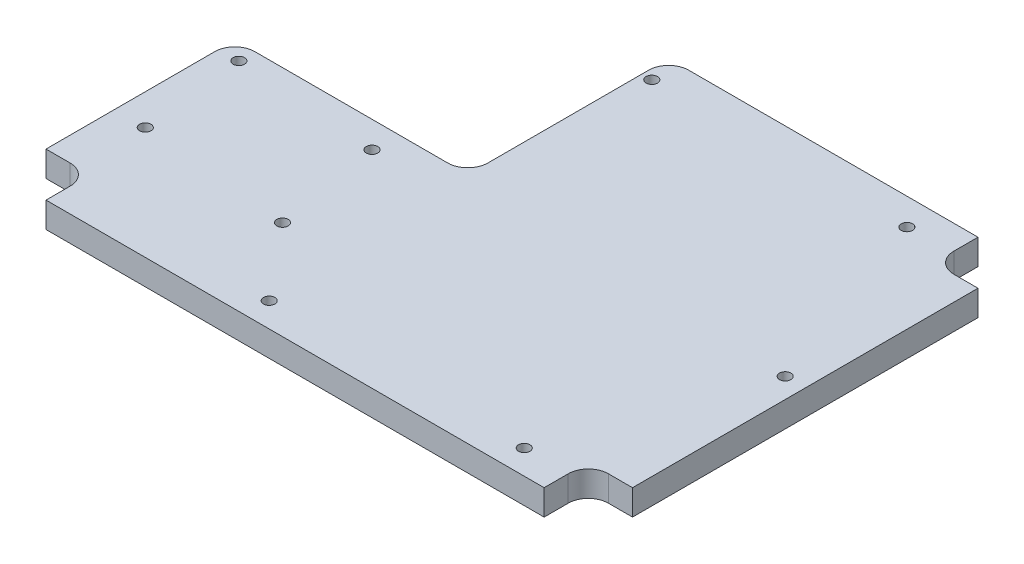
ISO-10303-21;
HEADER;
FILE_DESCRIPTION(('STEP AP214'),'2;1');
FILE_NAME('part.step','',(''),(''),'','','');
FILE_SCHEMA(('AUTOMOTIVE_DESIGN { 1 0 10303 214 1 1 1 1 }'));
ENDSEC;
DATA;
#1=APPLICATION_CONTEXT('core data for automotive mechanical design processes');
#2=APPLICATION_PROTOCOL_DEFINITION('international standard','automotive_design',2000,#1);
#3=PRODUCT_CONTEXT('',#1,'mechanical');
#4=PRODUCT('Part','Part','',(#3));
#5=PRODUCT_RELATED_PRODUCT_CATEGORY('part','',(#4));
#6=PRODUCT_DEFINITION_FORMATION('','',#4);
#7=PRODUCT_DEFINITION_CONTEXT('part definition',#1,'design');
#8=PRODUCT_DEFINITION('design','',#6,#7);
#9=PRODUCT_DEFINITION_SHAPE('','',#8);
#10=(LENGTH_UNIT() NAMED_UNIT(*) SI_UNIT(.MILLI.,.METRE.));
#11=(NAMED_UNIT(*) PLANE_ANGLE_UNIT() SI_UNIT($,.RADIAN.));
#12=(NAMED_UNIT(*) SI_UNIT($,.STERADIAN.) SOLID_ANGLE_UNIT());
#13=UNCERTAINTY_MEASURE_WITH_UNIT(LENGTH_MEASURE(1.E-05),#10,'distance_accuracy_value','');
#14=(GEOMETRIC_REPRESENTATION_CONTEXT(3) GLOBAL_UNCERTAINTY_ASSIGNED_CONTEXT((#13)) GLOBAL_UNIT_ASSIGNED_CONTEXT((#10,
#11,#12)) REPRESENTATION_CONTEXT('',''));
#15=CARTESIAN_POINT('',(0.,0.,0.));
#16=DIRECTION('',(0.,0.,1.));
#17=DIRECTION('',(1.,0.,0.));
#18=AXIS2_PLACEMENT_3D('',#15,#16,#17);
#19=CARTESIAN_POINT('',(-67.,6.35,48.0000000000003));
#20=DIRECTION('',(0.,1.,0.));
#21=DIRECTION('',(0.,0.,1.));
#22=AXIS2_PLACEMENT_3D('',#19,#20,#21);
#23=PLANE('',#22);
#24=CARTESIAN_POINT('',(-12.5264253099814,6.35,-47.3249999999997));
#25=DIRECTION('',(0.,1.,0.));
#26=DIRECTION('',(0.,0.,-1.));
#27=AXIS2_PLACEMENT_3D('',#24,#25,#26);
#28=CIRCLE('',#27,1.42240000000001);
#29=CARTESIAN_POINT('',(-12.5264253099814,6.35,-48.7473999999997));
#30=VERTEX_POINT('',#29);
#31=EDGE_CURVE('E388',#30,#30,#28,.T.);
#32=ORIENTED_EDGE('',*,*,#31,.F.);
#33=EDGE_LOOP('',(#32));
#34=FACE_BOUND('',#33,.T.);
#35=CARTESIAN_POINT('',(-12.5264253099814,6.35,47.9248996653101));
#36=DIRECTION('',(0.,1.,0.));
#37=DIRECTION('',(0.,0.,-1.));
#38=AXIS2_PLACEMENT_3D('',#35,#36,#37);
#39=CIRCLE('',#38,1.42240000000004);
#40=CARTESIAN_POINT('',(-12.5264253099814,6.35,46.5024996653101));
#41=VERTEX_POINT('',#40);
#42=EDGE_CURVE('E400',#41,#41,#39,.T.);
#43=ORIENTED_EDGE('',*,*,#42,.F.);
#44=EDGE_LOOP('',(#43));
#45=FACE_BOUND('',#44,.T.);
#46=CARTESIAN_POINT('',(-65.2864253099814,6.35,26.0000000000003));
#47=DIRECTION('',(0.,1.,0.));
#48=DIRECTION('',(0.,0.,1.));
#49=AXIS2_PLACEMENT_3D('',#46,#47,#48);
#50=CIRCLE('',#49,1.42240000000007);
#51=CARTESIAN_POINT('',(-65.2864253099814,6.35,27.4224000000004));
#52=VERTEX_POINT('',#51);
#53=EDGE_CURVE('E412',#52,#52,#50,.T.);
#54=ORIENTED_EDGE('',*,*,#53,.F.);
#55=EDGE_LOOP('',(#54));
#56=FACE_BOUND('',#55,.T.);
#57=CARTESIAN_POINT('',(-68.,6.35,0.));
#58=DIRECTION('',(0.,1.,0.));
#59=DIRECTION('',(0.,0.,1.));
#60=AXIS2_PLACEMENT_3D('',#57,#58,#59);
#61=CIRCLE('',#60,1.42240000000001);
#62=CARTESIAN_POINT('',(-68.,6.35,1.42240000000002));
#63=VERTEX_POINT('',#62);
#64=EDGE_CURVE('E424',#63,#63,#61,.T.);
#65=ORIENTED_EDGE('',*,*,#64,.F.);
#66=EDGE_LOOP('',(#65));
#67=FACE_BOUND('',#66,.T.);
#68=DIRECTION('',(1.,0.,0.));
#69=VECTOR('',#68,1.);
#70=CARTESIAN_POINT('',(-73.,6.35,43.0000000000003));
#71=LINE('',#70,#69);
#72=CARTESIAN_POINT('',(-73.,6.35,43.0000000000003));
#73=VERTEX_POINT('',#72);
#74=CARTESIAN_POINT('',(-67.,6.35,43.0000000000003));
#75=VERTEX_POINT('',#74);
#76=EDGE_CURVE('E223',#73,#75,#71,.T.);
#77=ORIENTED_EDGE('',*,*,#76,.T.);
#78=CARTESIAN_POINT('',(-67.,6.35,48.0000000000003));
#79=DIRECTION('',(0.,-1.,0.));
#80=DIRECTION('',(0.,0.,1.));
#81=AXIS2_PLACEMENT_3D('',#78,#79,#80);
#82=CIRCLE('',#81,5.);
#83=CARTESIAN_POINT('',(-62.,6.35,48.0000000000003));
#84=VERTEX_POINT('',#83);
#85=EDGE_CURVE('E121',#75,#84,#82,.T.);
#86=ORIENTED_EDGE('',*,*,#85,.T.);
#87=DIRECTION('',(0.,0.,1.));
#88=VECTOR('',#87,1.);
#89=CARTESIAN_POINT('',(-62.,6.35,48.0000000000003));
#90=LINE('',#89,#88);
#91=CARTESIAN_POINT('',(-62.,6.35,54.0000000000003));
#92=VERTEX_POINT('',#91);
#93=EDGE_CURVE('E268',#84,#92,#90,.T.);
#94=ORIENTED_EDGE('',*,*,#93,.T.);
#95=DIRECTION('',(1.,0.,0.));
#96=VECTOR('',#95,1.);
#97=CARTESIAN_POINT('',(-62.,6.35,54.0000000000003));
#98=LINE('',#97,#96);
#99=CARTESIAN_POINT('',(62.,6.35,54.0000000000003));
#100=VERTEX_POINT('',#99);
#101=EDGE_CURVE('E287',#92,#100,#98,.T.);
#102=ORIENTED_EDGE('',*,*,#101,.T.);
#103=DIRECTION('',(0.,0.,-1.));
#104=VECTOR('',#103,1.);
#105=CARTESIAN_POINT('',(62.,6.35,54.0000000000003));
#106=LINE('',#105,#104);
#107=CARTESIAN_POINT('',(61.9999999999997,6.35,48.0000000000003));
#108=VERTEX_POINT('',#107);
#109=EDGE_CURVE('E284',#100,#108,#106,.T.);
#110=ORIENTED_EDGE('',*,*,#109,.T.);
#111=CARTESIAN_POINT('',(67.,6.35,48.0000000000003));
#112=DIRECTION('',(0.,-1.,0.));
#113=DIRECTION('',(0.,0.,-1.));
#114=AXIS2_PLACEMENT_3D('',#111,#112,#113);
#115=CIRCLE('',#114,5.00000000000029);
#116=CARTESIAN_POINT('',(67.,6.35,42.9999999999997));
#117=VERTEX_POINT('',#116);
#118=EDGE_CURVE('E286',#108,#117,#115,.T.);
#119=ORIENTED_EDGE('',*,*,#118,.T.);
#120=DIRECTION('',(1.,0.,0.));
#121=VECTOR('',#120,1.);
#122=CARTESIAN_POINT('',(67.,6.35,42.9999999999997));
#123=LINE('',#122,#121);
#124=CARTESIAN_POINT('',(73.,6.35,42.9999999999997));
#125=VERTEX_POINT('',#124);
#126=EDGE_CURVE('E289',#117,#125,#123,.T.);
#127=ORIENTED_EDGE('',*,*,#126,.T.);
#128=DIRECTION('',(0.,0.,-1.));
#129=VECTOR('',#128,1.);
#130=CARTESIAN_POINT('',(73.,6.35,42.9999999999997));
#131=LINE('',#130,#129);
#132=CARTESIAN_POINT('',(73.,6.35,-42.9999999999997));
#133=VERTEX_POINT('',#132);
#134=EDGE_CURVE('E295',#125,#133,#131,.T.);
#135=ORIENTED_EDGE('',*,*,#134,.T.);
#136=DIRECTION('',(-1.,0.,0.));
#137=VECTOR('',#136,1.);
#138=CARTESIAN_POINT('',(73.,6.35,-42.9999999999997));
#139=LINE('',#138,#137);
#140=CARTESIAN_POINT('',(67.,6.35,-42.9999999999997));
#141=VERTEX_POINT('',#140);
#142=EDGE_CURVE('E297',#133,#141,#139,.T.);
#143=ORIENTED_EDGE('',*,*,#142,.T.);
#144=CARTESIAN_POINT('',(67.,6.35,-47.9999999999997));
#145=DIRECTION('',(0.,-1.,0.));
#146=DIRECTION('',(0.,0.,1.));
#147=AXIS2_PLACEMENT_3D('',#144,#145,#146);
#148=CIRCLE('',#147,5.00000000000001);
#149=CARTESIAN_POINT('',(62.,6.35,-47.9999999999997));
#150=VERTEX_POINT('',#149);
#151=EDGE_CURVE('E299',#141,#150,#148,.T.);
#152=ORIENTED_EDGE('',*,*,#151,.T.);
#153=DIRECTION('',(0.,0.,-1.));
#154=VECTOR('',#153,1.);
#155=CARTESIAN_POINT('',(62.,6.35,-47.9999999999997));
#156=LINE('',#155,#154);
#157=CARTESIAN_POINT('',(62.,6.35,-53.9999999999997));
#158=VERTEX_POINT('',#157);
#159=EDGE_CURVE('E301',#150,#158,#156,.T.);
#160=ORIENTED_EDGE('',*,*,#159,.T.);
#161=DIRECTION('',(-1.,0.,0.));
#162=VECTOR('',#161,1.);
#163=CARTESIAN_POINT('',(62.,6.35,-53.9999999999997));
#164=LINE('',#163,#162);
#165=CARTESIAN_POINT('',(-10.,6.35,-53.9999999999997));
#166=VERTEX_POINT('',#165);
#167=EDGE_CURVE('E303',#158,#166,#164,.T.);
#168=ORIENTED_EDGE('',*,*,#167,.T.);
#169=CARTESIAN_POINT('',(-10.,6.35,-48.9999999999997));
#170=DIRECTION('',(0.,1.,0.));
#171=DIRECTION('',(0.,0.,-1.));
#172=AXIS2_PLACEMENT_3D('',#169,#170,#171);
#173=CIRCLE('',#172,5.);
#174=CARTESIAN_POINT('',(-15.,6.35,-48.9999999999997));
#175=VERTEX_POINT('',#174);
#176=EDGE_CURVE('E305',#166,#175,#173,.T.);
#177=ORIENTED_EDGE('',*,*,#176,.T.);
#178=DIRECTION('',(0.,0.,1.));
#179=VECTOR('',#178,1.);
#180=CARTESIAN_POINT('',(-15.,6.35,-48.9999999999997));
#181=LINE('',#180,#179);
#182=CARTESIAN_POINT('',(-15.,6.35,-8.99999999999971));
#183=VERTEX_POINT('',#182);
#184=EDGE_CURVE('E307',#175,#183,#181,.T.);
#185=ORIENTED_EDGE('',*,*,#184,.T.);
#186=CARTESIAN_POINT('',(-20.,6.35,-8.99999999999971));
#187=DIRECTION('',(0.,-1.,0.));
#188=DIRECTION('',(0.,0.,1.));
#189=AXIS2_PLACEMENT_3D('',#186,#187,#188);
#190=CIRCLE('',#189,5.);
#191=CARTESIAN_POINT('',(-20.,6.35,-3.99999999999971));
#192=VERTEX_POINT('',#191);
#193=EDGE_CURVE('E170',#183,#192,#190,.T.);
#194=ORIENTED_EDGE('',*,*,#193,.T.);
#195=DIRECTION('',(-1.,0.,0.));
#196=VECTOR('',#195,1.);
#197=CARTESIAN_POINT('',(-20.,6.35,-3.99999999999971));
#198=LINE('',#197,#196);
#199=CARTESIAN_POINT('',(-68.,6.35,-3.99999999999969));
#200=VERTEX_POINT('',#199);
#201=EDGE_CURVE('E164',#192,#200,#198,.T.);
#202=ORIENTED_EDGE('',*,*,#201,.T.);
#203=CARTESIAN_POINT('',(-68.,6.35,1.00000000000031));
#204=DIRECTION('',(0.,1.,0.));
#205=DIRECTION('',(0.,0.,-1.));
#206=AXIS2_PLACEMENT_3D('',#203,#204,#205);
#207=CIRCLE('',#206,5.);
#208=CARTESIAN_POINT('',(-73.,6.35,1.00000000000031));
#209=VERTEX_POINT('',#208);
#210=EDGE_CURVE('E168',#200,#209,#207,.T.);
#211=ORIENTED_EDGE('',*,*,#210,.T.);
#212=DIRECTION('',(0.,0.,1.));
#213=VECTOR('',#212,1.);
#214=CARTESIAN_POINT('',(-73.,6.35,1.00000000000031));
#215=LINE('',#214,#213);
#216=EDGE_CURVE('E48',#209,#73,#215,.T.);
#217=ORIENTED_EDGE('',*,*,#216,.T.);
#218=EDGE_LOOP('',(#77,#86,#94,#102,#110,#119,#127,#135,#143,#152,#160,#168,#177,#185,#194,#202,
#211,#217));
#219=FACE_BOUND('',#218,.T.);
#220=CARTESIAN_POINT('',(68.,6.35,0.));
#221=DIRECTION('',(0.,1.,0.));
#222=DIRECTION('',(0.,0.,1.));
#223=AXIS2_PLACEMENT_3D('',#220,#221,#222);
#224=CIRCLE('',#223,1.42240000000001);
#225=CARTESIAN_POINT('',(68.,6.35,1.42240000000001));
#226=VERTEX_POINT('',#225);
#227=EDGE_CURVE('E192',#226,#226,#224,.T.);
#228=ORIENTED_EDGE('',*,*,#227,.F.);
#229=EDGE_LOOP('',(#228));
#230=FACE_BOUND('',#229,.T.);
#231=CARTESIAN_POINT('',(-27.6944253099814,6.35,29.4290000000003));
#232=DIRECTION('',(0.,1.,0.));
#233=DIRECTION('',(0.,0.,1.));
#234=AXIS2_PLACEMENT_3D('',#231,#232,#233);
#235=CIRCLE('',#234,1.42240000000004);
#236=CARTESIAN_POINT('',(-27.6944253099814,6.35,30.8514000000003));
#237=VERTEX_POINT('',#236);
#238=EDGE_CURVE('E418',#237,#237,#235,.T.);
#239=ORIENTED_EDGE('',*,*,#238,.F.);
#240=EDGE_LOOP('',(#239));
#241=FACE_BOUND('',#240,.T.);
#242=CARTESIAN_POINT('',(-32.2664253099814,6.35,2.58120000000029));
#243=DIRECTION('',(0.,1.,0.));
#244=DIRECTION('',(0.,0.,1.));
#245=AXIS2_PLACEMENT_3D('',#242,#243,#244);
#246=CIRCLE('',#245,1.42240000000004);
#247=CARTESIAN_POINT('',(-32.2664253099814,6.35,4.00360000000032));
#248=VERTEX_POINT('',#247);
#249=EDGE_CURVE('E406',#248,#248,#246,.T.);
#250=ORIENTED_EDGE('',*,*,#249,.F.);
#251=EDGE_LOOP('',(#250));
#252=FACE_BOUND('',#251,.T.);
#253=CARTESIAN_POINT('',(50.975,6.35,47.9248996653101));
#254=DIRECTION('',(0.,1.,0.));
#255=DIRECTION('',(0.,0.,-1.));
#256=AXIS2_PLACEMENT_3D('',#253,#254,#255);
#257=CIRCLE('',#256,1.42240000000003);
#258=CARTESIAN_POINT('',(50.975,6.35,46.5024996653101));
#259=VERTEX_POINT('',#258);
#260=EDGE_CURVE('E394',#259,#259,#257,.T.);
#261=ORIENTED_EDGE('',*,*,#260,.F.);
#262=EDGE_LOOP('',(#261));
#263=FACE_BOUND('',#262,.T.);
#264=CARTESIAN_POINT('',(50.975,6.35,-47.3249999999997));
#265=DIRECTION('',(0.,1.,0.));
#266=DIRECTION('',(0.,0.,-1.));
#267=AXIS2_PLACEMENT_3D('',#264,#265,#266);
#268=CIRCLE('',#267,1.42240000000001);
#269=CARTESIAN_POINT('',(50.975,6.35,-48.7473999999997));
#270=VERTEX_POINT('',#269);
#271=EDGE_CURVE('E379',#270,#270,#268,.T.);
#272=ORIENTED_EDGE('',*,*,#271,.F.);
#273=EDGE_LOOP('',(#272));
#274=FACE_BOUND('',#273,.T.);
#275=ADVANCED_FACE('F31',(#34,#45,#56,#67,#219,#230,#241,#252,#263,#274),#23,.T.);
#276=CARTESIAN_POINT('',(-67.,0.,48.0000000000003));
#277=DIRECTION('',(0.,1.,0.));
#278=DIRECTION('',(0.,0.,1.));
#279=AXIS2_PLACEMENT_3D('',#276,#277,#278);
#280=PLANE('',#279);
#281=CARTESIAN_POINT('',(-12.5264253099814,0.,-47.3249999999997));
#282=DIRECTION('',(0.,1.,0.));
#283=DIRECTION('',(0.,0.,-1.));
#284=AXIS2_PLACEMENT_3D('',#281,#282,#283);
#285=CIRCLE('',#284,1.42240000000001);
#286=CARTESIAN_POINT('',(-12.5264253099814,0.,-48.7473999999997));
#287=VERTEX_POINT('',#286);
#288=EDGE_CURVE('E385',#287,#287,#285,.T.);
#289=ORIENTED_EDGE('',*,*,#288,.T.);
#290=EDGE_LOOP('',(#289));
#291=FACE_BOUND('',#290,.T.);
#292=CARTESIAN_POINT('',(-12.5264253099814,0.,47.9248996653101));
#293=DIRECTION('',(0.,1.,0.));
#294=DIRECTION('',(0.,0.,-1.));
#295=AXIS2_PLACEMENT_3D('',#292,#293,#294);
#296=CIRCLE('',#295,1.42240000000004);
#297=CARTESIAN_POINT('',(-12.5264253099814,0.,46.5024996653101));
#298=VERTEX_POINT('',#297);
#299=EDGE_CURVE('E397',#298,#298,#296,.T.);
#300=ORIENTED_EDGE('',*,*,#299,.T.);
#301=EDGE_LOOP('',(#300));
#302=FACE_BOUND('',#301,.T.);
#303=CARTESIAN_POINT('',(-65.2864253099814,0.,26.0000000000003));
#304=DIRECTION('',(0.,1.,0.));
#305=DIRECTION('',(0.,0.,1.));
#306=AXIS2_PLACEMENT_3D('',#303,#304,#305);
#307=CIRCLE('',#306,1.42240000000007);
#308=CARTESIAN_POINT('',(-65.2864253099814,0.,27.4224000000004));
#309=VERTEX_POINT('',#308);
#310=EDGE_CURVE('E409',#309,#309,#307,.T.);
#311=ORIENTED_EDGE('',*,*,#310,.T.);
#312=EDGE_LOOP('',(#311));
#313=FACE_BOUND('',#312,.T.);
#314=CARTESIAN_POINT('',(-68.,0.,0.));
#315=DIRECTION('',(0.,1.,0.));
#316=DIRECTION('',(0.,0.,1.));
#317=AXIS2_PLACEMENT_3D('',#314,#315,#316);
#318=CIRCLE('',#317,1.42240000000001);
#319=CARTESIAN_POINT('',(-68.,0.,1.42240000000002));
#320=VERTEX_POINT('',#319);
#321=EDGE_CURVE('E421',#320,#320,#318,.T.);
#322=ORIENTED_EDGE('',*,*,#321,.T.);
#323=EDGE_LOOP('',(#322));
#324=FACE_BOUND('',#323,.T.);
#325=DIRECTION('',(1.,0.,0.));
#326=VECTOR('',#325,1.);
#327=CARTESIAN_POINT('',(-73.,0.,43.0000000000003));
#328=LINE('',#327,#326);
#329=CARTESIAN_POINT('',(-73.,0.,43.0000000000003));
#330=VERTEX_POINT('',#329);
#331=CARTESIAN_POINT('',(-67.,0.,43.0000000000003));
#332=VERTEX_POINT('',#331);
#333=EDGE_CURVE('E188',#330,#332,#328,.T.);
#334=ORIENTED_EDGE('',*,*,#333,.F.);
#335=DIRECTION('',(0.,0.,1.));
#336=VECTOR('',#335,1.);
#337=CARTESIAN_POINT('',(-73.,0.,1.00000000000031));
#338=LINE('',#337,#336);
#339=CARTESIAN_POINT('',(-73.,0.,1.00000000000031));
#340=VERTEX_POINT('',#339);
#341=EDGE_CURVE('E113',#340,#330,#338,.T.);
#342=ORIENTED_EDGE('',*,*,#341,.F.);
#343=CARTESIAN_POINT('',(-68.,0.,1.00000000000031));
#344=DIRECTION('',(0.,1.,0.));
#345=DIRECTION('',(0.,0.,-1.));
#346=AXIS2_PLACEMENT_3D('',#343,#344,#345);
#347=CIRCLE('',#346,5.);
#348=CARTESIAN_POINT('',(-68.,0.,-3.99999999999969));
#349=VERTEX_POINT('',#348);
#350=EDGE_CURVE('E107',#349,#340,#347,.T.);
#351=ORIENTED_EDGE('',*,*,#350,.F.);
#352=DIRECTION('',(-1.,0.,0.));
#353=VECTOR('',#352,1.);
#354=CARTESIAN_POINT('',(-20.,0.,-3.99999999999971));
#355=LINE('',#354,#353);
#356=CARTESIAN_POINT('',(-20.,0.,-3.99999999999971));
#357=VERTEX_POINT('',#356);
#358=EDGE_CURVE('E178',#357,#349,#355,.T.);
#359=ORIENTED_EDGE('',*,*,#358,.F.);
#360=CARTESIAN_POINT('',(-20.,0.,-8.99999999999971));
#361=DIRECTION('',(0.,-1.,0.));
#362=DIRECTION('',(0.,0.,1.));
#363=AXIS2_PLACEMENT_3D('',#360,#361,#362);
#364=CIRCLE('',#363,5.);
#365=CARTESIAN_POINT('',(-15.,0.,-8.99999999999971));
#366=VERTEX_POINT('',#365);
#367=EDGE_CURVE('E218',#366,#357,#364,.T.);
#368=ORIENTED_EDGE('',*,*,#367,.F.);
#369=DIRECTION('',(0.,0.,1.));
#370=VECTOR('',#369,1.);
#371=CARTESIAN_POINT('',(-15.,0.,-48.9999999999997));
#372=LINE('',#371,#370);
#373=CARTESIAN_POINT('',(-15.,0.,-48.9999999999997));
#374=VERTEX_POINT('',#373);
#375=EDGE_CURVE('E216',#374,#366,#372,.T.);
#376=ORIENTED_EDGE('',*,*,#375,.F.);
#377=CARTESIAN_POINT('',(-10.,0.,-48.9999999999997));
#378=DIRECTION('',(0.,1.,0.));
#379=DIRECTION('',(0.,0.,-1.));
#380=AXIS2_PLACEMENT_3D('',#377,#378,#379);
#381=CIRCLE('',#380,5.);
#382=CARTESIAN_POINT('',(-10.,0.,-53.9999999999997));
#383=VERTEX_POINT('',#382);
#384=EDGE_CURVE('E214',#383,#374,#381,.T.);
#385=ORIENTED_EDGE('',*,*,#384,.F.);
#386=DIRECTION('',(-1.,0.,0.));
#387=VECTOR('',#386,1.);
#388=CARTESIAN_POINT('',(62.,0.,-53.9999999999997));
#389=LINE('',#388,#387);
#390=CARTESIAN_POINT('',(62.,0.,-53.9999999999997));
#391=VERTEX_POINT('',#390);
#392=EDGE_CURVE('E212',#391,#383,#389,.T.);
#393=ORIENTED_EDGE('',*,*,#392,.F.);
#394=DIRECTION('',(0.,0.,-1.));
#395=VECTOR('',#394,1.);
#396=CARTESIAN_POINT('',(62.,0.,-47.9999999999997));
#397=LINE('',#396,#395);
#398=CARTESIAN_POINT('',(62.,0.,-47.9999999999997));
#399=VERTEX_POINT('',#398);
#400=EDGE_CURVE('E210',#399,#391,#397,.T.);
#401=ORIENTED_EDGE('',*,*,#400,.F.);
#402=CARTESIAN_POINT('',(67.,0.,-47.9999999999997));
#403=DIRECTION('',(0.,-1.,0.));
#404=DIRECTION('',(0.,0.,1.));
#405=AXIS2_PLACEMENT_3D('',#402,#403,#404);
#406=CIRCLE('',#405,5.00000000000001);
#407=CARTESIAN_POINT('',(67.,0.,-42.9999999999997));
#408=VERTEX_POINT('',#407);
#409=EDGE_CURVE('E208',#408,#399,#406,.T.);
#410=ORIENTED_EDGE('',*,*,#409,.F.);
#411=DIRECTION('',(-1.,0.,0.));
#412=VECTOR('',#411,1.);
#413=CARTESIAN_POINT('',(73.,0.,-42.9999999999997));
#414=LINE('',#413,#412);
#415=CARTESIAN_POINT('',(73.,0.,-42.9999999999997));
#416=VERTEX_POINT('',#415);
#417=EDGE_CURVE('E206',#416,#408,#414,.T.);
#418=ORIENTED_EDGE('',*,*,#417,.F.);
#419=DIRECTION('',(0.,0.,-1.));
#420=VECTOR('',#419,1.);
#421=CARTESIAN_POINT('',(73.,0.,42.9999999999997));
#422=LINE('',#421,#420);
#423=CARTESIAN_POINT('',(73.,0.,42.9999999999997));
#424=VERTEX_POINT('',#423);
#425=EDGE_CURVE('E204',#424,#416,#422,.T.);
#426=ORIENTED_EDGE('',*,*,#425,.F.);
#427=DIRECTION('',(1.,0.,0.));
#428=VECTOR('',#427,1.);
#429=CARTESIAN_POINT('',(67.,0.,42.9999999999997));
#430=LINE('',#429,#428);
#431=CARTESIAN_POINT('',(67.,0.,42.9999999999997));
#432=VERTEX_POINT('',#431);
#433=EDGE_CURVE('E202',#432,#424,#430,.T.);
#434=ORIENTED_EDGE('',*,*,#433,.F.);
#435=CARTESIAN_POINT('',(67.,0.,48.0000000000003));
#436=DIRECTION('',(0.,-1.,0.));
#437=DIRECTION('',(0.,0.,-1.));
#438=AXIS2_PLACEMENT_3D('',#435,#436,#437);
#439=CIRCLE('',#438,5.00000000000029);
#440=CARTESIAN_POINT('',(61.9999999999997,0.,48.0000000000003));
#441=VERTEX_POINT('',#440);
#442=EDGE_CURVE('E200',#441,#432,#439,.T.);
#443=ORIENTED_EDGE('',*,*,#442,.F.);
#444=DIRECTION('',(0.,0.,-1.));
#445=VECTOR('',#444,1.);
#446=CARTESIAN_POINT('',(62.,0.,54.0000000000003));
#447=LINE('',#446,#445);
#448=CARTESIAN_POINT('',(62.,0.,54.0000000000003));
#449=VERTEX_POINT('',#448);
#450=EDGE_CURVE('E198',#449,#441,#447,.T.);
#451=ORIENTED_EDGE('',*,*,#450,.F.);
#452=DIRECTION('',(1.,0.,0.));
#453=VECTOR('',#452,1.);
#454=CARTESIAN_POINT('',(-62.,0.,54.0000000000003));
#455=LINE('',#454,#453);
#456=CARTESIAN_POINT('',(-62.,0.,54.0000000000003));
#457=VERTEX_POINT('',#456);
#458=EDGE_CURVE('E196',#457,#449,#455,.T.);
#459=ORIENTED_EDGE('',*,*,#458,.F.);
#460=DIRECTION('',(0.,0.,1.));
#461=VECTOR('',#460,1.);
#462=CARTESIAN_POINT('',(-62.,0.,48.0000000000003));
#463=LINE('',#462,#461);
#464=CARTESIAN_POINT('',(-62.,0.,48.0000000000003));
#465=VERTEX_POINT('',#464);
#466=EDGE_CURVE('E194',#465,#457,#463,.T.);
#467=ORIENTED_EDGE('',*,*,#466,.F.);
#468=CARTESIAN_POINT('',(-67.,0.,48.0000000000003));
#469=DIRECTION('',(0.,-1.,0.));
#470=DIRECTION('',(0.,0.,1.));
#471=AXIS2_PLACEMENT_3D('',#468,#469,#470);
#472=CIRCLE('',#471,5.);
#473=EDGE_CURVE('E191',#332,#465,#472,.T.);
#474=ORIENTED_EDGE('',*,*,#473,.F.);
#475=EDGE_LOOP('',(#334,#342,#351,#359,#368,#376,#385,#393,#401,#410,#418,#426,#434,#443,#451,
#459,#467,#474));
#476=FACE_BOUND('',#475,.T.);
#477=CARTESIAN_POINT('',(68.,0.,0.));
#478=DIRECTION('',(0.,1.,0.));
#479=DIRECTION('',(0.,0.,1.));
#480=AXIS2_PLACEMENT_3D('',#477,#478,#479);
#481=CIRCLE('',#480,1.42240000000001);
#482=CARTESIAN_POINT('',(68.,0.,1.42240000000001));
#483=VERTEX_POINT('',#482);
#484=EDGE_CURVE('E427',#483,#483,#481,.T.);
#485=ORIENTED_EDGE('',*,*,#484,.T.);
#486=EDGE_LOOP('',(#485));
#487=FACE_BOUND('',#486,.T.);
#488=CARTESIAN_POINT('',(-27.6944253099814,0.,29.4290000000003));
#489=DIRECTION('',(0.,1.,0.));
#490=DIRECTION('',(0.,0.,1.));
#491=AXIS2_PLACEMENT_3D('',#488,#489,#490);
#492=CIRCLE('',#491,1.42240000000004);
#493=CARTESIAN_POINT('',(-27.6944253099814,0.,30.8514000000003));
#494=VERTEX_POINT('',#493);
#495=EDGE_CURVE('E415',#494,#494,#492,.T.);
#496=ORIENTED_EDGE('',*,*,#495,.T.);
#497=EDGE_LOOP('',(#496));
#498=FACE_BOUND('',#497,.T.);
#499=CARTESIAN_POINT('',(-32.2664253099814,0.,2.58120000000029));
#500=DIRECTION('',(0.,1.,0.));
#501=DIRECTION('',(0.,0.,1.));
#502=AXIS2_PLACEMENT_3D('',#499,#500,#501);
#503=CIRCLE('',#502,1.42240000000004);
#504=CARTESIAN_POINT('',(-32.2664253099814,0.,4.00360000000032));
#505=VERTEX_POINT('',#504);
#506=EDGE_CURVE('E403',#505,#505,#503,.T.);
#507=ORIENTED_EDGE('',*,*,#506,.T.);
#508=EDGE_LOOP('',(#507));
#509=FACE_BOUND('',#508,.T.);
#510=CARTESIAN_POINT('',(50.975,0.,47.9248996653101));
#511=DIRECTION('',(0.,1.,0.));
#512=DIRECTION('',(0.,0.,-1.));
#513=AXIS2_PLACEMENT_3D('',#510,#511,#512);
#514=CIRCLE('',#513,1.42240000000003);
#515=CARTESIAN_POINT('',(50.975,0.,46.5024996653101));
#516=VERTEX_POINT('',#515);
#517=EDGE_CURVE('E391',#516,#516,#514,.T.);
#518=ORIENTED_EDGE('',*,*,#517,.T.);
#519=EDGE_LOOP('',(#518));
#520=FACE_BOUND('',#519,.T.);
#521=CARTESIAN_POINT('',(50.975,0.,-47.3249999999997));
#522=DIRECTION('',(0.,1.,0.));
#523=DIRECTION('',(0.,0.,-1.));
#524=AXIS2_PLACEMENT_3D('',#521,#522,#523);
#525=CIRCLE('',#524,1.42240000000001);
#526=CARTESIAN_POINT('',(50.975,0.,-48.7473999999997));
#527=VERTEX_POINT('',#526);
#528=EDGE_CURVE('E382',#527,#527,#525,.T.);
#529=ORIENTED_EDGE('',*,*,#528,.T.);
#530=EDGE_LOOP('',(#529));
#531=FACE_BOUND('',#530,.T.);
#532=ADVANCED_FACE('F272',(#291,#302,#313,#324,#476,#487,#498,#509,#520,#531),#280,.F.);
#533=CARTESIAN_POINT('',(-73.,6.35,43.0000000000003));
#534=DIRECTION('',(0.,0.,-1.));
#535=DIRECTION('',(-1.,0.,0.));
#536=AXIS2_PLACEMENT_3D('',#533,#534,#535);
#537=PLANE('',#536);
#538=ORIENTED_EDGE('',*,*,#333,.T.);
#539=DIRECTION('',(0.,-1.,0.));
#540=VECTOR('',#539,1.);
#541=CARTESIAN_POINT('',(-67.,6.35,43.0000000000003));
#542=LINE('',#541,#540);
#543=EDGE_CURVE('E11',#75,#332,#542,.T.);
#544=ORIENTED_EDGE('',*,*,#543,.F.);
#545=ORIENTED_EDGE('',*,*,#76,.F.);
#546=DIRECTION('',(0.,-1.,0.));
#547=VECTOR('',#546,1.);
#548=CARTESIAN_POINT('',(-73.,6.35,43.0000000000003));
#549=LINE('',#548,#547);
#550=EDGE_CURVE('E184',#73,#330,#549,.T.);
#551=ORIENTED_EDGE('',*,*,#550,.T.);
#552=EDGE_LOOP('',(#538,#544,#545,#551));
#553=FACE_BOUND('',#552,.T.);
#554=ADVANCED_FACE('F33',(#553),#537,.F.);
#555=CARTESIAN_POINT('',(-67.,6.35,48.0000000000003));
#556=DIRECTION('',(0.,-1.,0.));
#557=DIRECTION('',(0.,0.,-1.));
#558=AXIS2_PLACEMENT_3D('',#555,#556,#557);
#559=CYLINDRICAL_SURFACE('',#558,5.);
#560=ORIENTED_EDGE('',*,*,#473,.T.);
#561=DIRECTION('',(0.,-1.,0.));
#562=VECTOR('',#561,1.);
#563=CARTESIAN_POINT('',(-62.,6.35,48.0000000000003));
#564=LINE('',#563,#562);
#565=EDGE_CURVE('E40',#84,#465,#564,.T.);
#566=ORIENTED_EDGE('',*,*,#565,.F.);
#567=ORIENTED_EDGE('',*,*,#85,.F.);
#568=ORIENTED_EDGE('',*,*,#543,.T.);
#569=EDGE_LOOP('',(#560,#566,#567,#568));
#570=FACE_BOUND('',#569,.T.);
#571=ADVANCED_FACE('F641',(#570),#559,.F.);
#572=CARTESIAN_POINT('',(-62.,6.35,48.0000000000003));
#573=DIRECTION('',(1.,0.,0.));
#574=DIRECTION('',(0.,0.,-1.));
#575=AXIS2_PLACEMENT_3D('',#572,#573,#574);
#576=PLANE('',#575);
#577=ORIENTED_EDGE('',*,*,#466,.T.);
#578=DIRECTION('',(0.,-1.,0.));
#579=VECTOR('',#578,1.);
#580=CARTESIAN_POINT('',(-62.,6.35,54.0000000000003));
#581=LINE('',#580,#579);
#582=EDGE_CURVE('E260',#92,#457,#581,.T.);
#583=ORIENTED_EDGE('',*,*,#582,.F.);
#584=ORIENTED_EDGE('',*,*,#93,.F.);
#585=ORIENTED_EDGE('',*,*,#565,.T.);
#586=EDGE_LOOP('',(#577,#583,#584,#585));
#587=FACE_BOUND('',#586,.T.);
#588=ADVANCED_FACE('F266',(#587),#576,.F.);
#589=CARTESIAN_POINT('',(-62.,6.35,54.0000000000003));
#590=DIRECTION('',(0.,0.,-1.));
#591=DIRECTION('',(-1.,0.,0.));
#592=AXIS2_PLACEMENT_3D('',#589,#590,#591);
#593=PLANE('',#592);
#594=ORIENTED_EDGE('',*,*,#458,.T.);
#595=DIRECTION('',(0.,-1.,0.));
#596=VECTOR('',#595,1.);
#597=CARTESIAN_POINT('',(62.,6.35,54.0000000000003));
#598=LINE('',#597,#596);
#599=EDGE_CURVE('E257',#100,#449,#598,.T.);
#600=ORIENTED_EDGE('',*,*,#599,.F.);
#601=ORIENTED_EDGE('',*,*,#101,.F.);
#602=ORIENTED_EDGE('',*,*,#582,.T.);
#603=EDGE_LOOP('',(#594,#600,#601,#602));
#604=FACE_BOUND('',#603,.T.);
#605=ADVANCED_FACE('F278',(#604),#593,.F.);
#606=CARTESIAN_POINT('',(62.,6.35,54.0000000000003));
#607=DIRECTION('',(-1.,0.,0.));
#608=DIRECTION('',(0.,0.,1.));
#609=AXIS2_PLACEMENT_3D('',#606,#607,#608);
#610=PLANE('',#609);
#611=ORIENTED_EDGE('',*,*,#450,.T.);
#612=DIRECTION('',(0.,-1.,0.));
#613=VECTOR('',#612,1.);
#614=CARTESIAN_POINT('',(61.9999999999997,6.35,48.0000000000003));
#615=LINE('',#614,#613);
#616=EDGE_CURVE('E254',#108,#441,#615,.T.);
#617=ORIENTED_EDGE('',*,*,#616,.F.);
#618=ORIENTED_EDGE('',*,*,#109,.F.);
#619=ORIENTED_EDGE('',*,*,#599,.T.);
#620=EDGE_LOOP('',(#611,#617,#618,#619));
#621=FACE_BOUND('',#620,.T.);
#622=ADVANCED_FACE('F282',(#621),#610,.F.);
#623=CARTESIAN_POINT('',(67.,6.35,48.0000000000003));
#624=DIRECTION('',(0.,-1.,0.));
#625=DIRECTION('',(0.,0.,-1.));
#626=AXIS2_PLACEMENT_3D('',#623,#624,#625);
#627=CYLINDRICAL_SURFACE('',#626,5.00000000000029);
#628=ORIENTED_EDGE('',*,*,#442,.T.);
#629=DIRECTION('',(0.,-1.,0.));
#630=VECTOR('',#629,1.);
#631=CARTESIAN_POINT('',(67.,6.35,42.9999999999997));
#632=LINE('',#631,#630);
#633=EDGE_CURVE('E251',#117,#432,#632,.T.);
#634=ORIENTED_EDGE('',*,*,#633,.F.);
#635=ORIENTED_EDGE('',*,*,#118,.F.);
#636=ORIENTED_EDGE('',*,*,#616,.T.);
#637=EDGE_LOOP('',(#628,#634,#635,#636));
#638=FACE_BOUND('',#637,.T.);
#639=ADVANCED_FACE('F606',(#638),#627,.F.);
#640=CARTESIAN_POINT('',(67.,6.35,42.9999999999997));
#641=DIRECTION('',(0.,0.,-1.));
#642=DIRECTION('',(-1.,0.,0.));
#643=AXIS2_PLACEMENT_3D('',#640,#641,#642);
#644=PLANE('',#643);
#645=ORIENTED_EDGE('',*,*,#433,.T.);
#646=DIRECTION('',(0.,-1.,0.));
#647=VECTOR('',#646,1.);
#648=CARTESIAN_POINT('',(73.,6.35,42.9999999999997));
#649=LINE('',#648,#647);
#650=EDGE_CURVE('E248',#125,#424,#649,.T.);
#651=ORIENTED_EDGE('',*,*,#650,.F.);
#652=ORIENTED_EDGE('',*,*,#126,.F.);
#653=ORIENTED_EDGE('',*,*,#633,.T.);
#654=EDGE_LOOP('',(#645,#651,#652,#653));
#655=FACE_BOUND('',#654,.T.);
#656=ADVANCED_FACE('F596',(#655),#644,.F.);
#657=CARTESIAN_POINT('',(73.,6.35,42.9999999999997));
#658=DIRECTION('',(-1.,0.,0.));
#659=DIRECTION('',(0.,0.,1.));
#660=AXIS2_PLACEMENT_3D('',#657,#658,#659);
#661=PLANE('',#660);
#662=ORIENTED_EDGE('',*,*,#425,.T.);
#663=DIRECTION('',(0.,-1.,0.));
#664=VECTOR('',#663,1.);
#665=CARTESIAN_POINT('',(73.,6.35,-42.9999999999997));
#666=LINE('',#665,#664);
#667=EDGE_CURVE('E245',#133,#416,#666,.T.);
#668=ORIENTED_EDGE('',*,*,#667,.F.);
#669=ORIENTED_EDGE('',*,*,#134,.F.);
#670=ORIENTED_EDGE('',*,*,#650,.T.);
#671=EDGE_LOOP('',(#662,#668,#669,#670));
#672=FACE_BOUND('',#671,.T.);
#673=ADVANCED_FACE('F586',(#672),#661,.F.);
#674=CARTESIAN_POINT('',(73.,6.35,-42.9999999999997));
#675=DIRECTION('',(0.,0.,1.));
#676=DIRECTION('',(1.,0.,0.));
#677=AXIS2_PLACEMENT_3D('',#674,#675,#676);
#678=PLANE('',#677);
#679=ORIENTED_EDGE('',*,*,#417,.T.);
#680=DIRECTION('',(0.,-1.,0.));
#681=VECTOR('',#680,1.);
#682=CARTESIAN_POINT('',(67.,6.35,-42.9999999999997));
#683=LINE('',#682,#681);
#684=EDGE_CURVE('E242',#141,#408,#683,.T.);
#685=ORIENTED_EDGE('',*,*,#684,.F.);
#686=ORIENTED_EDGE('',*,*,#142,.F.);
#687=ORIENTED_EDGE('',*,*,#667,.T.);
#688=EDGE_LOOP('',(#679,#685,#686,#687));
#689=FACE_BOUND('',#688,.T.);
#690=ADVANCED_FACE('F576',(#689),#678,.F.);
#691=CARTESIAN_POINT('',(67.,6.35,-47.9999999999997));
#692=DIRECTION('',(0.,-1.,0.));
#693=DIRECTION('',(0.,0.,-1.));
#694=AXIS2_PLACEMENT_3D('',#691,#692,#693);
#695=CYLINDRICAL_SURFACE('',#694,5.00000000000001);
#696=ORIENTED_EDGE('',*,*,#409,.T.);
#697=DIRECTION('',(0.,-1.,0.));
#698=VECTOR('',#697,1.);
#699=CARTESIAN_POINT('',(62.,6.35,-47.9999999999997));
#700=LINE('',#699,#698);
#701=EDGE_CURVE('E239',#150,#399,#700,.T.);
#702=ORIENTED_EDGE('',*,*,#701,.F.);
#703=ORIENTED_EDGE('',*,*,#151,.F.);
#704=ORIENTED_EDGE('',*,*,#684,.T.);
#705=EDGE_LOOP('',(#696,#702,#703,#704));
#706=FACE_BOUND('',#705,.T.);
#707=ADVANCED_FACE('F566',(#706),#695,.F.);
#708=CARTESIAN_POINT('',(62.,6.35,-47.9999999999997));
#709=DIRECTION('',(-1.,0.,0.));
#710=DIRECTION('',(0.,0.,1.));
#711=AXIS2_PLACEMENT_3D('',#708,#709,#710);
#712=PLANE('',#711);
#713=ORIENTED_EDGE('',*,*,#400,.T.);
#714=DIRECTION('',(0.,-1.,0.));
#715=VECTOR('',#714,1.);
#716=CARTESIAN_POINT('',(62.,6.35,-53.9999999999997));
#717=LINE('',#716,#715);
#718=EDGE_CURVE('E236',#158,#391,#717,.T.);
#719=ORIENTED_EDGE('',*,*,#718,.F.);
#720=ORIENTED_EDGE('',*,*,#159,.F.);
#721=ORIENTED_EDGE('',*,*,#701,.T.);
#722=EDGE_LOOP('',(#713,#719,#720,#721));
#723=FACE_BOUND('',#722,.T.);
#724=ADVANCED_FACE('F556',(#723),#712,.F.);
#725=CARTESIAN_POINT('',(62.,6.35,-53.9999999999997));
#726=DIRECTION('',(0.,0.,1.));
#727=DIRECTION('',(1.,0.,0.));
#728=AXIS2_PLACEMENT_3D('',#725,#726,#727);
#729=PLANE('',#728);
#730=ORIENTED_EDGE('',*,*,#392,.T.);
#731=DIRECTION('',(0.,-1.,0.));
#732=VECTOR('',#731,1.);
#733=CARTESIAN_POINT('',(-10.,6.35,-53.9999999999997));
#734=LINE('',#733,#732);
#735=EDGE_CURVE('E233',#166,#383,#734,.T.);
#736=ORIENTED_EDGE('',*,*,#735,.F.);
#737=ORIENTED_EDGE('',*,*,#167,.F.);
#738=ORIENTED_EDGE('',*,*,#718,.T.);
#739=EDGE_LOOP('',(#730,#736,#737,#738));
#740=FACE_BOUND('',#739,.T.);
#741=ADVANCED_FACE('F546',(#740),#729,.F.);
#742=CARTESIAN_POINT('',(-10.,6.35,-48.9999999999997));
#743=DIRECTION('',(0.,-1.,0.));
#744=DIRECTION('',(0.,0.,-1.));
#745=AXIS2_PLACEMENT_3D('',#742,#743,#744);
#746=CYLINDRICAL_SURFACE('',#745,5.);
#747=ORIENTED_EDGE('',*,*,#384,.T.);
#748=DIRECTION('',(0.,-1.,0.));
#749=VECTOR('',#748,1.);
#750=CARTESIAN_POINT('',(-15.,6.35,-48.9999999999997));
#751=LINE('',#750,#749);
#752=EDGE_CURVE('E230',#175,#374,#751,.T.);
#753=ORIENTED_EDGE('',*,*,#752,.F.);
#754=ORIENTED_EDGE('',*,*,#176,.F.);
#755=ORIENTED_EDGE('',*,*,#735,.T.);
#756=EDGE_LOOP('',(#747,#753,#754,#755));
#757=FACE_BOUND('',#756,.T.);
#758=ADVANCED_FACE('F537',(#757),#746,.T.);
#759=CARTESIAN_POINT('',(-15.,6.35,-48.9999999999997));
#760=DIRECTION('',(1.,0.,0.));
#761=DIRECTION('',(0.,0.,-1.));
#762=AXIS2_PLACEMENT_3D('',#759,#760,#761);
#763=PLANE('',#762);
#764=ORIENTED_EDGE('',*,*,#375,.T.);
#765=DIRECTION('',(0.,-1.,0.));
#766=VECTOR('',#765,1.);
#767=CARTESIAN_POINT('',(-15.,6.35,-8.99999999999971));
#768=LINE('',#767,#766);
#769=EDGE_CURVE('E227',#183,#366,#768,.T.);
#770=ORIENTED_EDGE('',*,*,#769,.F.);
#771=ORIENTED_EDGE('',*,*,#184,.F.);
#772=ORIENTED_EDGE('',*,*,#752,.T.);
#773=EDGE_LOOP('',(#764,#770,#771,#772));
#774=FACE_BOUND('',#773,.T.);
#775=ADVANCED_FACE('F313',(#774),#763,.F.);
#776=CARTESIAN_POINT('',(-20.,6.35,-8.99999999999971));
#777=DIRECTION('',(0.,-1.,0.));
#778=DIRECTION('',(0.,0.,-1.));
#779=AXIS2_PLACEMENT_3D('',#776,#777,#778);
#780=CYLINDRICAL_SURFACE('',#779,5.);
#781=ORIENTED_EDGE('',*,*,#367,.T.);
#782=DIRECTION('',(0.,-1.,0.));
#783=VECTOR('',#782,1.);
#784=CARTESIAN_POINT('',(-20.,6.35,-3.99999999999971));
#785=LINE('',#784,#783);
#786=EDGE_CURVE('E179',#192,#357,#785,.T.);
#787=ORIENTED_EDGE('',*,*,#786,.F.);
#788=ORIENTED_EDGE('',*,*,#193,.F.);
#789=ORIENTED_EDGE('',*,*,#769,.T.);
#790=EDGE_LOOP('',(#781,#787,#788,#789));
#791=FACE_BOUND('',#790,.T.);
#792=ADVANCED_FACE('F317',(#791),#780,.F.);
#793=CARTESIAN_POINT('',(-20.,6.35,-3.99999999999971));
#794=DIRECTION('',(0.,0.,1.));
#795=DIRECTION('',(1.,0.,0.));
#796=AXIS2_PLACEMENT_3D('',#793,#794,#795);
#797=PLANE('',#796);
#798=ORIENTED_EDGE('',*,*,#358,.T.);
#799=DIRECTION('',(0.,-1.,0.));
#800=VECTOR('',#799,1.);
#801=CARTESIAN_POINT('',(-68.,6.35,-3.99999999999969));
#802=LINE('',#801,#800);
#803=EDGE_CURVE('E175',#200,#349,#802,.T.);
#804=ORIENTED_EDGE('',*,*,#803,.F.);
#805=ORIENTED_EDGE('',*,*,#201,.F.);
#806=ORIENTED_EDGE('',*,*,#786,.T.);
#807=EDGE_LOOP('',(#798,#804,#805,#806));
#808=FACE_BOUND('',#807,.T.);
#809=ADVANCED_FACE('F176',(#808),#797,.F.);
#810=CARTESIAN_POINT('',(-68.,6.35,1.00000000000031));
#811=DIRECTION('',(0.,-1.,0.));
#812=DIRECTION('',(0.,0.,-1.));
#813=AXIS2_PLACEMENT_3D('',#810,#811,#812);
#814=CYLINDRICAL_SURFACE('',#813,5.);
#815=ORIENTED_EDGE('',*,*,#350,.T.);
#816=DIRECTION('',(0.,-1.,0.));
#817=VECTOR('',#816,1.);
#818=CARTESIAN_POINT('',(-73.,6.35,1.00000000000031));
#819=LINE('',#818,#817);
#820=EDGE_CURVE('E180',#209,#340,#819,.T.);
#821=ORIENTED_EDGE('',*,*,#820,.F.);
#822=ORIENTED_EDGE('',*,*,#210,.F.);
#823=ORIENTED_EDGE('',*,*,#803,.T.);
#824=EDGE_LOOP('',(#815,#821,#822,#823));
#825=FACE_BOUND('',#824,.T.);
#826=ADVANCED_FACE('F182',(#825),#814,.T.);
#827=CARTESIAN_POINT('',(-73.,6.35,1.00000000000031));
#828=DIRECTION('',(1.,0.,0.));
#829=DIRECTION('',(0.,0.,-1.));
#830=AXIS2_PLACEMENT_3D('',#827,#828,#829);
#831=PLANE('',#830);
#832=ORIENTED_EDGE('',*,*,#341,.T.);
#833=ORIENTED_EDGE('',*,*,#550,.F.);
#834=ORIENTED_EDGE('',*,*,#216,.F.);
#835=ORIENTED_EDGE('',*,*,#820,.T.);
#836=EDGE_LOOP('',(#832,#833,#834,#835));
#837=FACE_BOUND('',#836,.T.);
#838=ADVANCED_FACE('F321',(#837),#831,.F.);
#839=CARTESIAN_POINT('',(68.,6.35,0.));
#840=DIRECTION('',(0.,-1.,0.));
#841=DIRECTION('',(0.,0.,-1.));
#842=AXIS2_PLACEMENT_3D('',#839,#840,#841);
#843=CYLINDRICAL_SURFACE('',#842,1.42240000000001);
#844=ORIENTED_EDGE('',*,*,#227,.T.);
#845=EDGE_LOOP('',(#844));
#846=FACE_BOUND('',#845,.T.);
#847=ORIENTED_EDGE('',*,*,#484,.F.);
#848=EDGE_LOOP('',(#847));
#849=FACE_BOUND('',#848,.T.);
#850=ADVANCED_FACE('F323',(#846,#849),#843,.F.);
#851=CARTESIAN_POINT('',(-68.,6.35,0.));
#852=DIRECTION('',(0.,-1.,0.));
#853=DIRECTION('',(0.,0.,-1.));
#854=AXIS2_PLACEMENT_3D('',#851,#852,#853);
#855=CYLINDRICAL_SURFACE('',#854,1.42240000000001);
#856=ORIENTED_EDGE('',*,*,#64,.T.);
#857=EDGE_LOOP('',(#856));
#858=FACE_BOUND('',#857,.T.);
#859=ORIENTED_EDGE('',*,*,#321,.F.);
#860=EDGE_LOOP('',(#859));
#861=FACE_BOUND('',#860,.T.);
#862=ADVANCED_FACE('F329',(#858,#861),#855,.F.);
#863=CARTESIAN_POINT('',(-27.6944253099814,6.35,29.4290000000003));
#864=DIRECTION('',(0.,-1.,0.));
#865=DIRECTION('',(0.,0.,-1.));
#866=AXIS2_PLACEMENT_3D('',#863,#864,#865);
#867=CYLINDRICAL_SURFACE('',#866,1.42240000000004);
#868=ORIENTED_EDGE('',*,*,#238,.T.);
#869=EDGE_LOOP('',(#868));
#870=FACE_BOUND('',#869,.T.);
#871=ORIENTED_EDGE('',*,*,#495,.F.);
#872=EDGE_LOOP('',(#871));
#873=FACE_BOUND('',#872,.T.);
#874=ADVANCED_FACE('F346',(#870,#873),#867,.F.);
#875=CARTESIAN_POINT('',(-65.2864253099814,6.35,26.0000000000003));
#876=DIRECTION('',(0.,-1.,0.));
#877=DIRECTION('',(0.,0.,-1.));
#878=AXIS2_PLACEMENT_3D('',#875,#876,#877);
#879=CYLINDRICAL_SURFACE('',#878,1.42240000000007);
#880=ORIENTED_EDGE('',*,*,#53,.T.);
#881=EDGE_LOOP('',(#880));
#882=FACE_BOUND('',#881,.T.);
#883=ORIENTED_EDGE('',*,*,#310,.F.);
#884=EDGE_LOOP('',(#883));
#885=FACE_BOUND('',#884,.T.);
#886=ADVANCED_FACE('F350',(#882,#885),#879,.F.);
#887=CARTESIAN_POINT('',(-32.2664253099814,6.35,2.58120000000029));
#888=DIRECTION('',(0.,-1.,0.));
#889=DIRECTION('',(0.,0.,-1.));
#890=AXIS2_PLACEMENT_3D('',#887,#888,#889);
#891=CYLINDRICAL_SURFACE('',#890,1.42240000000004);
#892=ORIENTED_EDGE('',*,*,#249,.T.);
#893=EDGE_LOOP('',(#892));
#894=FACE_BOUND('',#893,.T.);
#895=ORIENTED_EDGE('',*,*,#506,.F.);
#896=EDGE_LOOP('',(#895));
#897=FACE_BOUND('',#896,.T.);
#898=ADVANCED_FACE('F354',(#894,#897),#891,.F.);
#899=CARTESIAN_POINT('',(-12.5264253099814,6.35,47.9248996653101));
#900=DIRECTION('',(0.,-1.,0.));
#901=DIRECTION('',(0.,0.,-1.));
#902=AXIS2_PLACEMENT_3D('',#899,#900,#901);
#903=CYLINDRICAL_SURFACE('',#902,1.42240000000004);
#904=ORIENTED_EDGE('',*,*,#42,.T.);
#905=EDGE_LOOP('',(#904));
#906=FACE_BOUND('',#905,.T.);
#907=ORIENTED_EDGE('',*,*,#299,.F.);
#908=EDGE_LOOP('',(#907));
#909=FACE_BOUND('',#908,.T.);
#910=ADVANCED_FACE('F358',(#906,#909),#903,.F.);
#911=CARTESIAN_POINT('',(50.975,6.35,47.9248996653101));
#912=DIRECTION('',(0.,-1.,0.));
#913=DIRECTION('',(0.,0.,-1.));
#914=AXIS2_PLACEMENT_3D('',#911,#912,#913);
#915=CYLINDRICAL_SURFACE('',#914,1.42240000000003);
#916=ORIENTED_EDGE('',*,*,#260,.T.);
#917=EDGE_LOOP('',(#916));
#918=FACE_BOUND('',#917,.T.);
#919=ORIENTED_EDGE('',*,*,#517,.F.);
#920=EDGE_LOOP('',(#919));
#921=FACE_BOUND('',#920,.T.);
#922=ADVANCED_FACE('F362',(#918,#921),#915,.F.);
#923=CARTESIAN_POINT('',(-12.5264253099814,6.35,-47.3249999999997));
#924=DIRECTION('',(0.,-1.,0.));
#925=DIRECTION('',(0.,0.,-1.));
#926=AXIS2_PLACEMENT_3D('',#923,#924,#925);
#927=CYLINDRICAL_SURFACE('',#926,1.42240000000001);
#928=ORIENTED_EDGE('',*,*,#31,.T.);
#929=EDGE_LOOP('',(#928));
#930=FACE_BOUND('',#929,.T.);
#931=ORIENTED_EDGE('',*,*,#288,.F.);
#932=EDGE_LOOP('',(#931));
#933=FACE_BOUND('',#932,.T.);
#934=ADVANCED_FACE('F366',(#930,#933),#927,.F.);
#935=CARTESIAN_POINT('',(50.975,6.35,-47.3249999999997));
#936=DIRECTION('',(0.,-1.,0.));
#937=DIRECTION('',(0.,0.,-1.));
#938=AXIS2_PLACEMENT_3D('',#935,#936,#937);
#939=CYLINDRICAL_SURFACE('',#938,1.42240000000001);
#940=ORIENTED_EDGE('',*,*,#271,.T.);
#941=EDGE_LOOP('',(#940));
#942=FACE_BOUND('',#941,.T.);
#943=ORIENTED_EDGE('',*,*,#528,.F.);
#944=EDGE_LOOP('',(#943));
#945=FACE_BOUND('',#944,.T.);
#946=ADVANCED_FACE('F370',(#942,#945),#939,.F.);
#947=CLOSED_SHELL('',(#275,#532,#554,#571,#588,#605,#622,#639,#656,#673,#690,#707,#724,#741,
#758,#775,#792,#809,#826,#838,#850,#862,#874,#886,#898,#910,#922,#934,#946));
#948=MANIFOLD_SOLID_BREP('B2',#947);
#949=ADVANCED_BREP_SHAPE_REPRESENTATION('',(#18,#948),#14);
#950=SHAPE_DEFINITION_REPRESENTATION(#9,#949);
ENDSEC;
END-ISO-10303-21;
